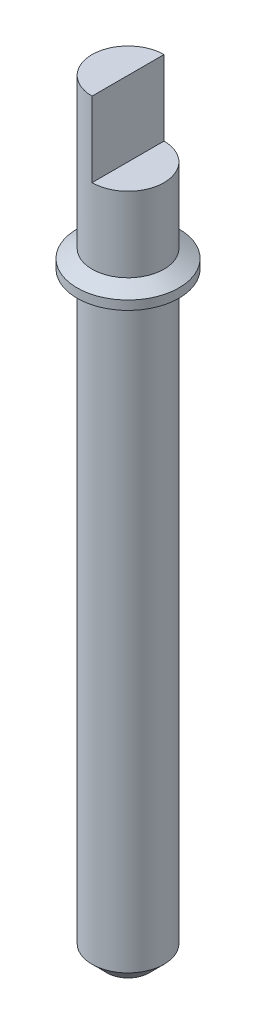
ISO-10303-21;
HEADER;
FILE_DESCRIPTION(('STEP AP214'),'2;1');
FILE_NAME('part.step','',(''),(''),'','','');
FILE_SCHEMA(('AUTOMOTIVE_DESIGN { 1 0 10303 214 1 1 1 1 }'));
ENDSEC;
DATA;
#1=APPLICATION_CONTEXT('core data for automotive mechanical design processes');
#2=APPLICATION_PROTOCOL_DEFINITION('international standard','automotive_design',2000,#1);
#3=PRODUCT_CONTEXT('',#1,'mechanical');
#4=PRODUCT('Part','Part','',(#3));
#5=PRODUCT_RELATED_PRODUCT_CATEGORY('part','',(#4));
#6=PRODUCT_DEFINITION_FORMATION('','',#4);
#7=PRODUCT_DEFINITION_CONTEXT('part definition',#1,'design');
#8=PRODUCT_DEFINITION('design','',#6,#7);
#9=PRODUCT_DEFINITION_SHAPE('','',#8);
#10=(LENGTH_UNIT() NAMED_UNIT(*) SI_UNIT(.MILLI.,.METRE.));
#11=(NAMED_UNIT(*) PLANE_ANGLE_UNIT() SI_UNIT($,.RADIAN.));
#12=(NAMED_UNIT(*) SI_UNIT($,.STERADIAN.) SOLID_ANGLE_UNIT());
#13=UNCERTAINTY_MEASURE_WITH_UNIT(LENGTH_MEASURE(1.E-05),#10,'distance_accuracy_value','');
#14=(GEOMETRIC_REPRESENTATION_CONTEXT(3) GLOBAL_UNCERTAINTY_ASSIGNED_CONTEXT((#13)) GLOBAL_UNIT_ASSIGNED_CONTEXT((#10,
#11,#12)) REPRESENTATION_CONTEXT('',''));
#15=CARTESIAN_POINT('',(0.,0.,0.));
#16=DIRECTION('',(0.,0.,1.));
#17=DIRECTION('',(1.,0.,0.));
#18=AXIS2_PLACEMENT_3D('',#15,#16,#17);
#19=CARTESIAN_POINT('',(0.,-10.0693375672974,0.));
#20=DIRECTION('',(0.,-1.,0.));
#21=DIRECTION('',(1.,0.,0.));
#22=AXIS2_PLACEMENT_3D('',#19,#20,#21);
#23=PLANE('',#22);
#24=CARTESIAN_POINT('',(0.,-10.0693375672974,0.));
#25=DIRECTION('',(0.,-1.,0.));
#26=DIRECTION('',(1.,0.,0.));
#27=AXIS2_PLACEMENT_3D('',#24,#25,#26);
#28=CIRCLE('',#27,0.350000000000003);
#29=CARTESIAN_POINT('',(0.350000000000003,-10.0693375672974,0.));
#30=VERTEX_POINT('',#29);
#31=EDGE_CURVE('E41',#30,#30,#28,.T.);
#32=ORIENTED_EDGE('',*,*,#31,.T.);
#33=EDGE_LOOP('',(#32));
#34=FACE_BOUND('',#33,.T.);
#35=ADVANCED_FACE('F33',(#34),#23,.T.);
#36=CARTESIAN_POINT('',(0.,2.71933756729741,0.));
#37=DIRECTION('',(0.,1.,0.));
#38=DIRECTION('',(-1.,0.,0.));
#39=AXIS2_PLACEMENT_3D('',#36,#37,#38);
#40=PLANE('',#39);
#41=DIRECTION('',(0.,0.,1.));
#42=VECTOR('',#41,1.);
#43=CARTESIAN_POINT('',(0.,2.71933756729741,-0.6));
#44=LINE('',#43,#42);
#45=CARTESIAN_POINT('',(0.,2.71933756729741,-0.6));
#46=VERTEX_POINT('',#45);
#47=CARTESIAN_POINT('',(0.,2.71933756729741,0.6));
#48=VERTEX_POINT('',#47);
#49=EDGE_CURVE('E62',#46,#48,#44,.T.);
#50=ORIENTED_EDGE('',*,*,#49,.F.);
#51=CARTESIAN_POINT('',(0.,2.71933756729741,0.));
#52=DIRECTION('',(0.,-1.,0.));
#53=DIRECTION('',(1.,0.,0.));
#54=AXIS2_PLACEMENT_3D('',#51,#52,#53);
#55=CIRCLE('',#54,0.6);
#56=EDGE_CURVE('E71',#48,#46,#55,.T.);
#57=ORIENTED_EDGE('',*,*,#56,.F.);
#58=EDGE_LOOP('',(#50,#57));
#59=FACE_BOUND('',#58,.T.);
#60=ADVANCED_FACE('F70',(#59),#40,.T.);
#61=CARTESIAN_POINT('',(0.,0.,0.));
#62=DIRECTION('',(0.,-1.,0.));
#63=DIRECTION('',(1.,0.,0.));
#64=AXIS2_PLACEMENT_3D('',#61,#62,#63);
#65=CYLINDRICAL_SURFACE('',#64,0.6);
#66=DIRECTION('',(0.,1.,0.));
#67=VECTOR('',#66,1.);
#68=CARTESIAN_POINT('',(0.,1.46933756729741,-0.6));
#69=LINE('',#68,#67);
#70=CARTESIAN_POINT('',(0.,1.46933756729741,-0.6));
#71=VERTEX_POINT('',#70);
#72=EDGE_CURVE('E59',#71,#46,#69,.T.);
#73=ORIENTED_EDGE('',*,*,#72,.F.);
#74=CARTESIAN_POINT('',(0.,1.46933756729741,0.));
#75=DIRECTION('',(0.,1.,0.));
#76=DIRECTION('',(1.,0.,0.));
#77=AXIS2_PLACEMENT_3D('',#74,#75,#76);
#78=CIRCLE('',#77,0.6);
#79=CARTESIAN_POINT('',(0.,1.46933756729741,0.6));
#80=VERTEX_POINT('',#79);
#81=EDGE_CURVE('E52',#80,#71,#78,.T.);
#82=ORIENTED_EDGE('',*,*,#81,.F.);
#83=DIRECTION('',(0.,1.,0.));
#84=VECTOR('',#83,1.);
#85=CARTESIAN_POINT('',(0.,1.46933756729741,0.6));
#86=LINE('',#85,#84);
#87=EDGE_CURVE('E66',#80,#48,#86,.T.);
#88=ORIENTED_EDGE('',*,*,#87,.T.);
#89=ORIENTED_EDGE('',*,*,#56,.T.);
#90=EDGE_LOOP('',(#73,#82,#88,#89));
#91=FACE_BOUND('',#90,.T.);
#92=CARTESIAN_POINT('',(0.,0.219337567297406,0.));
#93=DIRECTION('',(0.,-1.,0.));
#94=DIRECTION('',(1.,0.,0.));
#95=AXIS2_PLACEMENT_3D('',#92,#93,#94);
#96=CIRCLE('',#95,0.6);
#97=CARTESIAN_POINT('',(0.6,0.219337567297406,0.));
#98=VERTEX_POINT('',#97);
#99=EDGE_CURVE('E75',#98,#98,#96,.T.);
#100=ORIENTED_EDGE('',*,*,#99,.F.);
#101=EDGE_LOOP('',(#100));
#102=FACE_BOUND('',#101,.T.);
#103=ADVANCED_FACE('F73',(#91,#102),#65,.T.);
#104=CARTESIAN_POINT('',(0.,0.075,0.));
#105=DIRECTION('',(0.,-1.,0.));
#106=DIRECTION('',(1.,0.,0.));
#107=AXIS2_PLACEMENT_3D('',#104,#105,#106);
#108=CONICAL_SURFACE('',#107,0.85,1.0471975511966);
#109=ORIENTED_EDGE('',*,*,#99,.T.);
#110=EDGE_LOOP('',(#109));
#111=FACE_BOUND('',#110,.T.);
#112=CARTESIAN_POINT('',(0.,0.075,0.));
#113=DIRECTION('',(0.,-1.,0.));
#114=DIRECTION('',(1.,0.,0.));
#115=AXIS2_PLACEMENT_3D('',#112,#113,#114);
#116=CIRCLE('',#115,0.85);
#117=CARTESIAN_POINT('',(0.85,0.075,0.));
#118=VERTEX_POINT('',#117);
#119=EDGE_CURVE('E79',#118,#118,#116,.T.);
#120=ORIENTED_EDGE('',*,*,#119,.F.);
#121=EDGE_LOOP('',(#120));
#122=FACE_BOUND('',#121,.T.);
#123=ADVANCED_FACE('F107',(#111,#122),#108,.T.);
#124=CARTESIAN_POINT('',(0.,0.,0.));
#125=DIRECTION('',(0.,-1.,0.));
#126=DIRECTION('',(1.,0.,0.));
#127=AXIS2_PLACEMENT_3D('',#124,#125,#126);
#128=CYLINDRICAL_SURFACE('',#127,0.85);
#129=ORIENTED_EDGE('',*,*,#119,.T.);
#130=EDGE_LOOP('',(#129));
#131=FACE_BOUND('',#130,.T.);
#132=CARTESIAN_POINT('',(0.,-0.075,0.));
#133=DIRECTION('',(0.,-1.,0.));
#134=DIRECTION('',(1.,0.,0.));
#135=AXIS2_PLACEMENT_3D('',#132,#133,#134);
#136=CIRCLE('',#135,0.85);
#137=CARTESIAN_POINT('',(0.85,-0.075,0.));
#138=VERTEX_POINT('',#137);
#139=EDGE_CURVE('E84',#138,#138,#136,.T.);
#140=ORIENTED_EDGE('',*,*,#139,.F.);
#141=EDGE_LOOP('',(#140));
#142=FACE_BOUND('',#141,.T.);
#143=ADVANCED_FACE('F98',(#131,#142),#128,.T.);
#144=CARTESIAN_POINT('',(0.,-0.219337567297405,0.));
#145=DIRECTION('',(0.,1.,0.));
#146=DIRECTION('',(-1.,0.,0.));
#147=AXIS2_PLACEMENT_3D('',#144,#145,#146);
#148=CONICAL_SURFACE('',#147,0.6,1.0471975511966);
#149=ORIENTED_EDGE('',*,*,#139,.T.);
#150=EDGE_LOOP('',(#149));
#151=FACE_BOUND('',#150,.T.);
#152=CARTESIAN_POINT('',(0.,-0.219337567297405,0.));
#153=DIRECTION('',(0.,-1.,0.));
#154=DIRECTION('',(1.,0.,0.));
#155=AXIS2_PLACEMENT_3D('',#152,#153,#154);
#156=CIRCLE('',#155,0.6);
#157=CARTESIAN_POINT('',(0.6,-0.219337567297405,0.));
#158=VERTEX_POINT('',#157);
#159=EDGE_CURVE('E87',#158,#158,#156,.T.);
#160=ORIENTED_EDGE('',*,*,#159,.F.);
#161=EDGE_LOOP('',(#160));
#162=FACE_BOUND('',#161,.T.);
#163=ADVANCED_FACE('F96',(#151,#162),#148,.T.);
#164=CARTESIAN_POINT('',(0.,0.,0.));
#165=DIRECTION('',(0.,-1.,0.));
#166=DIRECTION('',(1.,0.,0.));
#167=AXIS2_PLACEMENT_3D('',#164,#165,#166);
#168=CYLINDRICAL_SURFACE('',#167,0.600000000000002);
#169=CARTESIAN_POINT('',(0.,-9.8193375672974,0.));
#170=DIRECTION('',(0.,-1.,0.));
#171=DIRECTION('',(1.,0.,0.));
#172=AXIS2_PLACEMENT_3D('',#169,#170,#171);
#173=CIRCLE('',#172,0.600000000000002);
#174=CARTESIAN_POINT('',(0.600000000000001,-9.8193375672974,0.));
#175=VERTEX_POINT('',#174);
#176=EDGE_CURVE('E11',#175,#175,#173,.F.);
#177=ORIENTED_EDGE('',*,*,#176,.T.);
#178=EDGE_LOOP('',(#177));
#179=FACE_BOUND('',#178,.T.);
#180=ORIENTED_EDGE('',*,*,#159,.T.);
#181=EDGE_LOOP('',(#180));
#182=FACE_BOUND('',#181,.T.);
#183=ADVANCED_FACE('F94',(#179,#182),#168,.T.);
#184=CARTESIAN_POINT('',(0.,1.46933756729741,-0.6));
#185=DIRECTION('',(-1.,0.,0.));
#186=DIRECTION('',(0.,-1.,0.));
#187=AXIS2_PLACEMENT_3D('',#184,#185,#186);
#188=PLANE('',#187);
#189=ORIENTED_EDGE('',*,*,#49,.T.);
#190=ORIENTED_EDGE('',*,*,#87,.F.);
#191=DIRECTION('',(0.,0.,1.));
#192=VECTOR('',#191,1.);
#193=CARTESIAN_POINT('',(0.,1.46933756729741,-0.6));
#194=LINE('',#193,#192);
#195=EDGE_CURVE('E47',#71,#80,#194,.T.);
#196=ORIENTED_EDGE('',*,*,#195,.F.);
#197=ORIENTED_EDGE('',*,*,#72,.T.);
#198=EDGE_LOOP('',(#189,#190,#196,#197));
#199=FACE_BOUND('',#198,.T.);
#200=ADVANCED_FACE('F61',(#199),#188,.F.);
#201=CARTESIAN_POINT('',(0.,1.46933756729741,0.));
#202=DIRECTION('',(0.,-1.,0.));
#203=DIRECTION('',(1.,0.,0.));
#204=AXIS2_PLACEMENT_3D('',#201,#202,#203);
#205=PLANE('',#204);
#206=ORIENTED_EDGE('',*,*,#81,.T.);
#207=ORIENTED_EDGE('',*,*,#195,.T.);
#208=EDGE_LOOP('',(#206,#207));
#209=FACE_BOUND('',#208,.T.);
#210=ADVANCED_FACE('F159',(#209),#205,.F.);
#211=CARTESIAN_POINT('',(0.,-10.0693375672974,0.));
#212=DIRECTION('',(0.,1.,0.));
#213=DIRECTION('',(-1.,0.,0.));
#214=AXIS2_PLACEMENT_3D('',#211,#212,#213);
#215=CONICAL_SURFACE('',#214,0.350000000000003,0.785398163397445);
#216=ORIENTED_EDGE('',*,*,#176,.F.);
#217=EDGE_LOOP('',(#216));
#218=FACE_BOUND('',#217,.T.);
#219=ORIENTED_EDGE('',*,*,#31,.F.);
#220=EDGE_LOOP('',(#219));
#221=FACE_BOUND('',#220,.T.);
#222=ADVANCED_FACE('F35',(#218,#221),#215,.T.);
#223=CLOSED_SHELL('',(#35,#60,#103,#123,#143,#163,#183,#200,#210,#222));
#224=MANIFOLD_SOLID_BREP('B2',#223);
#225=ADVANCED_BREP_SHAPE_REPRESENTATION('',(#18,#224),#14);
#226=SHAPE_DEFINITION_REPRESENTATION(#9,#225);
ENDSEC;
END-ISO-10303-21;
